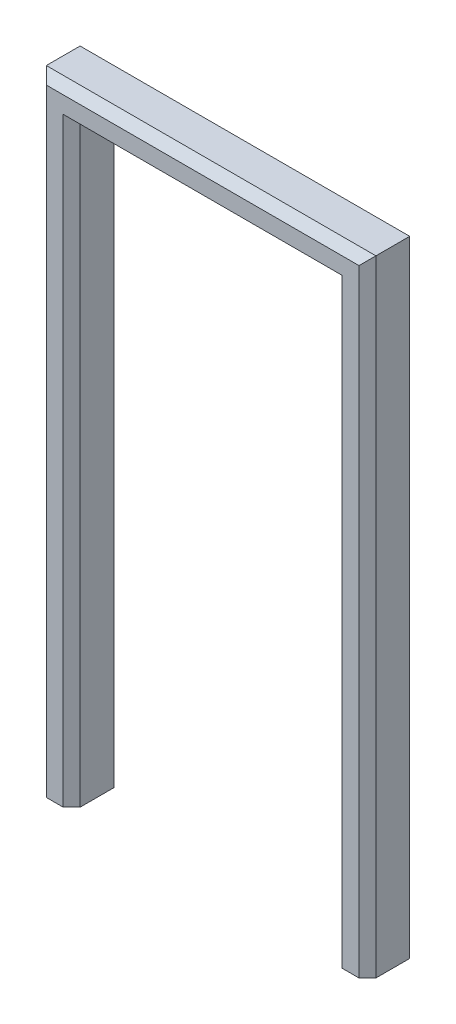
ISO-10303-21;
HEADER;
FILE_DESCRIPTION(('STEP AP214'),'2;1');
FILE_NAME('part.step','',(''),(''),'','','');
FILE_SCHEMA(('AUTOMOTIVE_DESIGN { 1 0 10303 214 1 1 1 1 }'));
ENDSEC;
DATA;
#1=APPLICATION_CONTEXT('core data for automotive mechanical design processes');
#2=APPLICATION_PROTOCOL_DEFINITION('international standard','automotive_design',2000,#1);
#3=PRODUCT_CONTEXT('',#1,'mechanical');
#4=PRODUCT('Part','Part','',(#3));
#5=PRODUCT_RELATED_PRODUCT_CATEGORY('part','',(#4));
#6=PRODUCT_DEFINITION_FORMATION('','',#4);
#7=PRODUCT_DEFINITION_CONTEXT('part definition',#1,'design');
#8=PRODUCT_DEFINITION('design','',#6,#7);
#9=PRODUCT_DEFINITION_SHAPE('','',#8);
#10=(LENGTH_UNIT() NAMED_UNIT(*) SI_UNIT(.MILLI.,.METRE.));
#11=(NAMED_UNIT(*) PLANE_ANGLE_UNIT() SI_UNIT($,.RADIAN.));
#12=(NAMED_UNIT(*) SI_UNIT($,.STERADIAN.) SOLID_ANGLE_UNIT());
#13=UNCERTAINTY_MEASURE_WITH_UNIT(LENGTH_MEASURE(1.E-05),#10,'distance_accuracy_value','');
#14=(GEOMETRIC_REPRESENTATION_CONTEXT(3) GLOBAL_UNCERTAINTY_ASSIGNED_CONTEXT((#13)) GLOBAL_UNIT_ASSIGNED_CONTEXT((#10,
#11,#12)) REPRESENTATION_CONTEXT('',''));
#15=CARTESIAN_POINT('',(0.,0.,0.));
#16=DIRECTION('',(0.,0.,1.));
#17=DIRECTION('',(1.,0.,0.));
#18=AXIS2_PLACEMENT_3D('',#15,#16,#17);
#19=CARTESIAN_POINT('',(0.,140.,0.));
#20=DIRECTION('',(0.,1.,0.));
#21=DIRECTION('',(0.,0.,1.));
#22=AXIS2_PLACEMENT_3D('',#19,#20,#21);
#23=PLANE('',#22);
#24=DIRECTION('',(0.,0.,-1.));
#25=VECTOR('',#24,1.);
#26=CARTESIAN_POINT('',(-31.,140.,6.));
#27=LINE('',#26,#25);
#28=CARTESIAN_POINT('',(-31.,140.,3.99999999999999));
#29=VERTEX_POINT('',#28);
#30=CARTESIAN_POINT('',(-31.,140.,-4.00000000000001));
#31=VERTEX_POINT('',#30);
#32=EDGE_CURVE('E176',#29,#31,#27,.T.);
#33=ORIENTED_EDGE('',*,*,#32,.T.);
#34=DIRECTION('',(1.,0.,0.));
#35=VECTOR('',#34,1.);
#36=CARTESIAN_POINT('',(0.,140.,-4.00000000000001));
#37=LINE('',#36,#35);
#38=CARTESIAN_POINT('',(31.,140.,-4.));
#39=VERTEX_POINT('',#38);
#40=EDGE_CURVE('E213',#31,#39,#37,.T.);
#41=ORIENTED_EDGE('',*,*,#40,.T.);
#42=DIRECTION('',(0.,0.,1.));
#43=VECTOR('',#42,1.);
#44=CARTESIAN_POINT('',(31.,140.,5.99999999999999));
#45=LINE('',#44,#43);
#46=CARTESIAN_POINT('',(31.,140.,3.99999999999998));
#47=VERTEX_POINT('',#46);
#48=EDGE_CURVE('E245',#39,#47,#45,.T.);
#49=ORIENTED_EDGE('',*,*,#48,.T.);
#50=DIRECTION('',(-1.,0.,0.));
#51=VECTOR('',#50,1.);
#52=CARTESIAN_POINT('',(0.,140.,3.99999999999998));
#53=LINE('',#52,#51);
#54=EDGE_CURVE('E210',#47,#29,#53,.T.);
#55=ORIENTED_EDGE('',*,*,#54,.T.);
#56=EDGE_LOOP('',(#33,#41,#49,#55));
#57=FACE_BOUND('',#56,.T.);
#58=ADVANCED_FACE('F51',(#57),#23,.F.);
#59=CARTESIAN_POINT('',(-31.,140.,6.));
#60=DIRECTION('',(-1.,0.,0.));
#61=DIRECTION('',(0.,0.,1.));
#62=AXIS2_PLACEMENT_3D('',#59,#60,#61);
#63=PLANE('',#62);
#64=DIRECTION('',(0.,0.,-1.));
#65=VECTOR('',#64,1.);
#66=CARTESIAN_POINT('',(-31.,0.,6.));
#67=LINE('',#66,#65);
#68=CARTESIAN_POINT('',(-31.,0.,3.99999999999999));
#69=VERTEX_POINT('',#68);
#70=CARTESIAN_POINT('',(-31.,0.,-4.00000000000001));
#71=VERTEX_POINT('',#70);
#72=EDGE_CURVE('E188',#69,#71,#67,.T.);
#73=ORIENTED_EDGE('',*,*,#72,.T.);
#74=DIRECTION('',(0.,1.,0.));
#75=VECTOR('',#74,1.);
#76=CARTESIAN_POINT('',(-31.,140.,-4.00000000000001));
#77=LINE('',#76,#75);
#78=EDGE_CURVE('E192',#71,#31,#77,.T.);
#79=ORIENTED_EDGE('',*,*,#78,.T.);
#80=ORIENTED_EDGE('',*,*,#32,.F.);
#81=DIRECTION('',(0.,-1.,0.));
#82=VECTOR('',#81,1.);
#83=CARTESIAN_POINT('',(-31.,140.,3.99999999999999));
#84=LINE('',#83,#82);
#85=EDGE_CURVE('E216',#29,#69,#84,.T.);
#86=ORIENTED_EDGE('',*,*,#85,.T.);
#87=EDGE_LOOP('',(#73,#79,#80,#86));
#88=FACE_BOUND('',#87,.T.);
#89=ADVANCED_FACE('F383',(#88),#63,.F.);
#90=CARTESIAN_POINT('',(-39.,140.,-6.));
#91=DIRECTION('',(0.,0.,1.));
#92=DIRECTION('',(1.,0.,0.));
#93=AXIS2_PLACEMENT_3D('',#90,#91,#92);
#94=PLANE('',#93);
#95=DIRECTION('',(1.,0.,0.));
#96=VECTOR('',#95,1.);
#97=CARTESIAN_POINT('',(39.,146.,-6.));
#98=LINE('',#97,#96);
#99=CARTESIAN_POINT('',(-37.,146.,-6.));
#100=VERTEX_POINT('',#99);
#101=CARTESIAN_POINT('',(37.,146.,-6.));
#102=VERTEX_POINT('',#101);
#103=EDGE_CURVE('E299',#100,#102,#98,.T.);
#104=ORIENTED_EDGE('',*,*,#103,.T.);
#105=DIRECTION('',(0.,-1.,0.));
#106=VECTOR('',#105,1.);
#107=CARTESIAN_POINT('',(37.,140.,-6.));
#108=LINE('',#107,#106);
#109=CARTESIAN_POINT('',(37.,0.,-6.00000000000001));
#110=VERTEX_POINT('',#109);
#111=EDGE_CURVE('E302',#102,#110,#108,.T.);
#112=ORIENTED_EDGE('',*,*,#111,.T.);
#113=DIRECTION('',(-1.,0.,0.));
#114=VECTOR('',#113,1.);
#115=CARTESIAN_POINT('',(31.,0.,-6.00000000000001));
#116=LINE('',#115,#114);
#117=CARTESIAN_POINT('',(33.,0.,-6.00000000000001));
#118=VERTEX_POINT('',#117);
#119=EDGE_CURVE('E360',#110,#118,#116,.T.);
#120=ORIENTED_EDGE('',*,*,#119,.T.);
#121=DIRECTION('',(0.,1.,0.));
#122=VECTOR('',#121,1.);
#123=CARTESIAN_POINT('',(33.,140.,-6.));
#124=LINE('',#123,#122);
#125=CARTESIAN_POINT('',(33.,142.,-6.));
#126=VERTEX_POINT('',#125);
#127=EDGE_CURVE('E293',#118,#126,#124,.T.);
#128=ORIENTED_EDGE('',*,*,#127,.T.);
#129=DIRECTION('',(-1.,0.,0.));
#130=VECTOR('',#129,1.);
#131=CARTESIAN_POINT('',(-39.,142.,-6.));
#132=LINE('',#131,#130);
#133=CARTESIAN_POINT('',(-33.,142.,-6.));
#134=VERTEX_POINT('',#133);
#135=EDGE_CURVE('E170',#126,#134,#132,.T.);
#136=ORIENTED_EDGE('',*,*,#135,.T.);
#137=DIRECTION('',(0.,-1.,0.));
#138=VECTOR('',#137,1.);
#139=CARTESIAN_POINT('',(-33.,140.,-6.));
#140=LINE('',#139,#138);
#141=CARTESIAN_POINT('',(-33.,0.,-6.));
#142=VERTEX_POINT('',#141);
#143=EDGE_CURVE('E164',#134,#142,#140,.T.);
#144=ORIENTED_EDGE('',*,*,#143,.T.);
#145=DIRECTION('',(-1.,0.,0.));
#146=VECTOR('',#145,1.);
#147=CARTESIAN_POINT('',(-39.,0.,-6.));
#148=LINE('',#147,#146);
#149=CARTESIAN_POINT('',(-37.,0.,-6.));
#150=VERTEX_POINT('',#149);
#151=EDGE_CURVE('E167',#142,#150,#148,.T.);
#152=ORIENTED_EDGE('',*,*,#151,.T.);
#153=DIRECTION('',(0.,1.,0.));
#154=VECTOR('',#153,1.);
#155=CARTESIAN_POINT('',(-37.,140.,-6.));
#156=LINE('',#155,#154);
#157=EDGE_CURVE('E296',#150,#100,#156,.T.);
#158=ORIENTED_EDGE('',*,*,#157,.T.);
#159=EDGE_LOOP('',(#104,#112,#120,#128,#136,#144,#152,#158));
#160=FACE_BOUND('',#159,.T.);
#161=ADVANCED_FACE('F166',(#160),#94,.F.);
#162=CARTESIAN_POINT('',(-39.,140.,6.));
#163=DIRECTION('',(1.,0.,0.));
#164=DIRECTION('',(0.,0.,-1.));
#165=AXIS2_PLACEMENT_3D('',#162,#163,#164);
#166=PLANE('',#165);
#167=DIRECTION('',(0.,0.,1.));
#168=VECTOR('',#167,1.);
#169=CARTESIAN_POINT('',(-39.,148.,-6.));
#170=LINE('',#169,#168);
#171=CARTESIAN_POINT('',(-39.,148.,-3.99999999999998));
#172=VERTEX_POINT('',#171);
#173=CARTESIAN_POINT('',(-39.,148.,3.99999999999999));
#174=VERTEX_POINT('',#173);
#175=EDGE_CURVE('E340',#172,#174,#170,.T.);
#176=ORIENTED_EDGE('',*,*,#175,.F.);
#177=DIRECTION('',(0.,-1.,0.));
#178=VECTOR('',#177,1.);
#179=CARTESIAN_POINT('',(-39.,140.,-3.99999999999998));
#180=LINE('',#179,#178);
#181=CARTESIAN_POINT('',(-39.,0.,-3.99999999999998));
#182=VERTEX_POINT('',#181);
#183=EDGE_CURVE('E332',#172,#182,#180,.T.);
#184=ORIENTED_EDGE('',*,*,#183,.T.);
#185=DIRECTION('',(0.,0.,1.));
#186=VECTOR('',#185,1.);
#187=CARTESIAN_POINT('',(-39.,0.,6.));
#188=LINE('',#187,#186);
#189=CARTESIAN_POINT('',(-39.,0.,3.99999999999999));
#190=VERTEX_POINT('',#189);
#191=EDGE_CURVE('E187',#182,#190,#188,.T.);
#192=ORIENTED_EDGE('',*,*,#191,.T.);
#193=DIRECTION('',(0.,1.,0.));
#194=VECTOR('',#193,1.);
#195=CARTESIAN_POINT('',(-39.,140.,3.99999999999999));
#196=LINE('',#195,#194);
#197=EDGE_CURVE('E278',#190,#174,#196,.T.);
#198=ORIENTED_EDGE('',*,*,#197,.T.);
#199=EDGE_LOOP('',(#176,#184,#192,#198));
#200=FACE_BOUND('',#199,.T.);
#201=ADVANCED_FACE('F338',(#200),#166,.F.);
#202=CARTESIAN_POINT('',(-39.,140.,6.));
#203=DIRECTION('',(0.,0.,-1.));
#204=DIRECTION('',(-1.,0.,0.));
#205=AXIS2_PLACEMENT_3D('',#202,#203,#204);
#206=PLANE('',#205);
#207=DIRECTION('',(1.,0.,0.));
#208=VECTOR('',#207,1.);
#209=CARTESIAN_POINT('',(-39.,0.,6.));
#210=LINE('',#209,#208);
#211=CARTESIAN_POINT('',(-37.,0.,6.));
#212=VERTEX_POINT('',#211);
#213=CARTESIAN_POINT('',(-33.,0.,6.));
#214=VERTEX_POINT('',#213);
#215=EDGE_CURVE('E281',#212,#214,#210,.T.);
#216=ORIENTED_EDGE('',*,*,#215,.T.);
#217=DIRECTION('',(0.,1.,0.));
#218=VECTOR('',#217,1.);
#219=CARTESIAN_POINT('',(-33.,140.,6.));
#220=LINE('',#219,#218);
#221=CARTESIAN_POINT('',(-33.,142.,6.));
#222=VERTEX_POINT('',#221);
#223=EDGE_CURVE('E11',#214,#222,#220,.T.);
#224=ORIENTED_EDGE('',*,*,#223,.T.);
#225=DIRECTION('',(1.,0.,0.));
#226=VECTOR('',#225,1.);
#227=CARTESIAN_POINT('',(-39.,142.,6.));
#228=LINE('',#227,#226);
#229=CARTESIAN_POINT('',(33.,142.,6.));
#230=VERTEX_POINT('',#229);
#231=EDGE_CURVE('E62',#222,#230,#228,.T.);
#232=ORIENTED_EDGE('',*,*,#231,.T.);
#233=DIRECTION('',(0.,-1.,0.));
#234=VECTOR('',#233,1.);
#235=CARTESIAN_POINT('',(33.,140.,6.));
#236=LINE('',#235,#234);
#237=CARTESIAN_POINT('',(33.,0.,5.99999999999999));
#238=VERTEX_POINT('',#237);
#239=EDGE_CURVE('E231',#230,#238,#236,.T.);
#240=ORIENTED_EDGE('',*,*,#239,.T.);
#241=DIRECTION('',(1.,0.,0.));
#242=VECTOR('',#241,1.);
#243=CARTESIAN_POINT('',(31.,0.,5.99999999999999));
#244=LINE('',#243,#242);
#245=CARTESIAN_POINT('',(37.,0.,5.99999999999999));
#246=VERTEX_POINT('',#245);
#247=EDGE_CURVE('E377',#238,#246,#244,.T.);
#248=ORIENTED_EDGE('',*,*,#247,.T.);
#249=DIRECTION('',(0.,1.,0.));
#250=VECTOR('',#249,1.);
#251=CARTESIAN_POINT('',(37.,140.,6.));
#252=LINE('',#251,#250);
#253=CARTESIAN_POINT('',(37.,146.,6.));
#254=VERTEX_POINT('',#253);
#255=EDGE_CURVE('E228',#246,#254,#252,.T.);
#256=ORIENTED_EDGE('',*,*,#255,.T.);
#257=DIRECTION('',(-1.,0.,0.));
#258=VECTOR('',#257,1.);
#259=CARTESIAN_POINT('',(-39.,146.,6.));
#260=LINE('',#259,#258);
#261=CARTESIAN_POINT('',(-37.,146.,6.));
#262=VERTEX_POINT('',#261);
#263=EDGE_CURVE('E225',#254,#262,#260,.T.);
#264=ORIENTED_EDGE('',*,*,#263,.T.);
#265=DIRECTION('',(0.,-1.,0.));
#266=VECTOR('',#265,1.);
#267=CARTESIAN_POINT('',(-37.,140.,6.));
#268=LINE('',#267,#266);
#269=EDGE_CURVE('E222',#262,#212,#268,.T.);
#270=ORIENTED_EDGE('',*,*,#269,.T.);
#271=EDGE_LOOP('',(#216,#224,#232,#240,#248,#256,#264,#270));
#272=FACE_BOUND('',#271,.T.);
#273=ADVANCED_FACE('F280',(#272),#206,.F.);
#274=CARTESIAN_POINT('',(0.,0.,0.));
#275=DIRECTION('',(0.,-1.,0.));
#276=DIRECTION('',(0.,0.,-1.));
#277=AXIS2_PLACEMENT_3D('',#274,#275,#276);
#278=PLANE('',#277);
#279=ORIENTED_EDGE('',*,*,#191,.F.);
#280=DIRECTION('',(-0.707106781186548,0.,0.707106781186548));
#281=VECTOR('',#280,1.);
#282=CARTESIAN_POINT('',(-21.5,0.,-21.5));
#283=LINE('',#282,#281);
#284=EDGE_CURVE('E185',#182,#150,#283,.F.);
#285=ORIENTED_EDGE('',*,*,#284,.T.);
#286=ORIENTED_EDGE('',*,*,#151,.F.);
#287=DIRECTION('',(-0.70710678118655,0.,-0.707106781186545));
#288=VECTOR('',#287,1.);
#289=CARTESIAN_POINT('',(-13.4999999999999,0.,13.5));
#290=LINE('',#289,#288);
#291=EDGE_CURVE('E182',#142,#71,#290,.F.);
#292=ORIENTED_EDGE('',*,*,#291,.T.);
#293=ORIENTED_EDGE('',*,*,#72,.F.);
#294=DIRECTION('',(0.707106781186548,0.,-0.707106781186547));
#295=VECTOR('',#294,1.);
#296=CARTESIAN_POINT('',(-13.5,0.,-13.5));
#297=LINE('',#296,#295);
#298=EDGE_CURVE('E194',#69,#214,#297,.F.);
#299=ORIENTED_EDGE('',*,*,#298,.T.);
#300=ORIENTED_EDGE('',*,*,#215,.F.);
#301=DIRECTION('',(0.707106781186548,0.,0.707106781186548));
#302=VECTOR('',#301,1.);
#303=CARTESIAN_POINT('',(-21.5,0.,21.5));
#304=LINE('',#303,#302);
#305=EDGE_CURVE('E200',#212,#190,#304,.F.);
#306=ORIENTED_EDGE('',*,*,#305,.T.);
#307=EDGE_LOOP('',(#279,#285,#286,#292,#293,#299,#300,#306));
#308=FACE_BOUND('',#307,.T.);
#309=ADVANCED_FACE('F180',(#308),#278,.T.);
#310=CARTESIAN_POINT('',(39.,148.,-6.));
#311=DIRECTION('',(-1.,0.,0.));
#312=DIRECTION('',(0.,0.,1.));
#313=AXIS2_PLACEMENT_3D('',#310,#311,#312);
#314=PLANE('',#313);
#315=DIRECTION('',(0.,0.,-1.));
#316=VECTOR('',#315,1.);
#317=CARTESIAN_POINT('',(39.,0.,5.99999999999999));
#318=LINE('',#317,#316);
#319=CARTESIAN_POINT('',(39.,0.,3.99999999999998));
#320=VERTEX_POINT('',#319);
#321=CARTESIAN_POINT('',(39.,0.,-3.99999999999998));
#322=VERTEX_POINT('',#321);
#323=EDGE_CURVE('E359',#320,#322,#318,.T.);
#324=ORIENTED_EDGE('',*,*,#323,.T.);
#325=DIRECTION('',(0.,1.,0.));
#326=VECTOR('',#325,1.);
#327=CARTESIAN_POINT('',(39.,148.,-3.99999999999998));
#328=LINE('',#327,#326);
#329=CARTESIAN_POINT('',(39.,148.,-3.99999999999998));
#330=VERTEX_POINT('',#329);
#331=EDGE_CURVE('E322',#322,#330,#328,.T.);
#332=ORIENTED_EDGE('',*,*,#331,.T.);
#333=DIRECTION('',(0.,0.,-1.));
#334=VECTOR('',#333,1.);
#335=CARTESIAN_POINT('',(39.,148.,-6.));
#336=LINE('',#335,#334);
#337=CARTESIAN_POINT('',(39.,148.,3.99999999999998));
#338=VERTEX_POINT('',#337);
#339=EDGE_CURVE('E369',#338,#330,#336,.T.);
#340=ORIENTED_EDGE('',*,*,#339,.F.);
#341=DIRECTION('',(0.,-1.,0.));
#342=VECTOR('',#341,1.);
#343=CARTESIAN_POINT('',(39.,148.,3.99999999999998));
#344=LINE('',#343,#342);
#345=EDGE_CURVE('E318',#338,#320,#344,.T.);
#346=ORIENTED_EDGE('',*,*,#345,.T.);
#347=EDGE_LOOP('',(#324,#332,#340,#346));
#348=FACE_BOUND('',#347,.T.);
#349=ADVANCED_FACE('F362',(#348),#314,.F.);
#350=CARTESIAN_POINT('',(0.,148.,0.));
#351=DIRECTION('',(0.,1.,0.));
#352=DIRECTION('',(0.,0.,1.));
#353=AXIS2_PLACEMENT_3D('',#350,#351,#352);
#354=PLANE('',#353);
#355=ORIENTED_EDGE('',*,*,#339,.T.);
#356=DIRECTION('',(-1.,0.,0.));
#357=VECTOR('',#356,1.);
#358=CARTESIAN_POINT('',(-39.,148.,-3.99999999999998));
#359=LINE('',#358,#357);
#360=EDGE_CURVE('E327',#330,#172,#359,.T.);
#361=ORIENTED_EDGE('',*,*,#360,.T.);
#362=ORIENTED_EDGE('',*,*,#175,.T.);
#363=DIRECTION('',(1.,0.,0.));
#364=VECTOR('',#363,1.);
#365=CARTESIAN_POINT('',(39.,148.,3.99999999999998));
#366=LINE('',#365,#364);
#367=EDGE_CURVE('E273',#174,#338,#366,.T.);
#368=ORIENTED_EDGE('',*,*,#367,.T.);
#369=EDGE_LOOP('',(#355,#361,#362,#368));
#370=FACE_BOUND('',#369,.T.);
#371=ADVANCED_FACE('F424',(#370),#354,.T.);
#372=CARTESIAN_POINT('',(31.,140.,5.99999999999999));
#373=DIRECTION('',(1.,0.,0.));
#374=DIRECTION('',(0.,0.,-1.));
#375=AXIS2_PLACEMENT_3D('',#372,#373,#374);
#376=PLANE('',#375);
#377=ORIENTED_EDGE('',*,*,#48,.F.);
#378=DIRECTION('',(0.,-1.,0.));
#379=VECTOR('',#378,1.);
#380=CARTESIAN_POINT('',(31.,140.,-4.00000000000001));
#381=LINE('',#380,#379);
#382=CARTESIAN_POINT('',(31.,0.,-4.));
#383=VERTEX_POINT('',#382);
#384=EDGE_CURVE('E206',#39,#383,#381,.T.);
#385=ORIENTED_EDGE('',*,*,#384,.T.);
#386=DIRECTION('',(0.,0.,1.));
#387=VECTOR('',#386,1.);
#388=CARTESIAN_POINT('',(31.,0.,5.99999999999999));
#389=LINE('',#388,#387);
#390=CARTESIAN_POINT('',(31.,0.,3.99999999999998));
#391=VERTEX_POINT('',#390);
#392=EDGE_CURVE('E371',#383,#391,#389,.T.);
#393=ORIENTED_EDGE('',*,*,#392,.T.);
#394=DIRECTION('',(0.,1.,0.));
#395=VECTOR('',#394,1.);
#396=CARTESIAN_POINT('',(31.,140.,3.99999999999998));
#397=LINE('',#396,#395);
#398=EDGE_CURVE('E198',#391,#47,#397,.T.);
#399=ORIENTED_EDGE('',*,*,#398,.T.);
#400=EDGE_LOOP('',(#377,#385,#393,#399));
#401=FACE_BOUND('',#400,.T.);
#402=ADVANCED_FACE('F406',(#401),#376,.F.);
#403=CARTESIAN_POINT('',(0.,0.,0.));
#404=DIRECTION('',(0.,-1.,0.));
#405=DIRECTION('',(0.,0.,-1.));
#406=AXIS2_PLACEMENT_3D('',#403,#404,#405);
#407=PLANE('',#406);
#408=ORIENTED_EDGE('',*,*,#119,.F.);
#409=DIRECTION('',(-0.707106781186547,0.,-0.707106781186548));
#410=VECTOR('',#409,1.);
#411=CARTESIAN_POINT('',(21.5,0.,-21.5));
#412=LINE('',#411,#410);
#413=EDGE_CURVE('E315',#110,#322,#412,.F.);
#414=ORIENTED_EDGE('',*,*,#413,.T.);
#415=ORIENTED_EDGE('',*,*,#323,.F.);
#416=DIRECTION('',(0.707106781186549,0.,-0.707106781186546));
#417=VECTOR('',#416,1.);
#418=CARTESIAN_POINT('',(21.4999999999999,0.,21.5));
#419=LINE('',#418,#417);
#420=EDGE_CURVE('E306',#320,#246,#419,.F.);
#421=ORIENTED_EDGE('',*,*,#420,.T.);
#422=ORIENTED_EDGE('',*,*,#247,.F.);
#423=DIRECTION('',(0.707106781186546,0.,0.707106781186549));
#424=VECTOR('',#423,1.);
#425=CARTESIAN_POINT('',(13.5000000000001,0.,-13.5));
#426=LINE('',#425,#424);
#427=EDGE_CURVE('E309',#238,#391,#426,.F.);
#428=ORIENTED_EDGE('',*,*,#427,.T.);
#429=ORIENTED_EDGE('',*,*,#392,.F.);
#430=DIRECTION('',(-0.707106781186551,0.,0.707106781186544));
#431=VECTOR('',#430,1.);
#432=CARTESIAN_POINT('',(13.4999999999998,0.,13.5));
#433=LINE('',#432,#431);
#434=EDGE_CURVE('E312',#383,#118,#433,.F.);
#435=ORIENTED_EDGE('',*,*,#434,.T.);
#436=EDGE_LOOP('',(#408,#414,#415,#421,#422,#428,#429,#435));
#437=FACE_BOUND('',#436,.T.);
#438=ADVANCED_FACE('F358',(#437),#407,.T.);
#439=CARTESIAN_POINT('',(-39.,140.,-3.99999999999998));
#440=DIRECTION('',(0.707106781186547,0.,0.707106781186547));
#441=DIRECTION('',(0.,-1.,0.));
#442=AXIS2_PLACEMENT_3D('',#439,#440,#441);
#443=PLANE('',#442);
#444=ORIENTED_EDGE('',*,*,#284,.F.);
#445=ORIENTED_EDGE('',*,*,#183,.F.);
#446=DIRECTION('',(-0.577350269189627,0.577350269189623,0.577350269189627));
#447=VECTOR('',#446,1.);
#448=CARTESIAN_POINT('',(-36.3333333333333,145.333333333333,-6.66666666666664));
#449=LINE('',#448,#447);
#450=EDGE_CURVE('E240',#100,#172,#449,.T.);
#451=ORIENTED_EDGE('',*,*,#450,.F.);
#452=ORIENTED_EDGE('',*,*,#157,.F.);
#453=EDGE_LOOP('',(#444,#445,#451,#452));
#454=FACE_BOUND('',#453,.T.);
#455=ADVANCED_FACE('F343',(#454),#443,.F.);
#456=CARTESIAN_POINT('',(0.,148.,-3.99999999999998));
#457=DIRECTION('',(0.,0.70710678118655,-0.707106781186545));
#458=DIRECTION('',(1.,0.,0.));
#459=AXIS2_PLACEMENT_3D('',#456,#457,#458);
#460=PLANE('',#459);
#461=ORIENTED_EDGE('',*,*,#450,.T.);
#462=ORIENTED_EDGE('',*,*,#360,.F.);
#463=DIRECTION('',(0.577350269189627,0.577350269189623,0.577350269189627));
#464=VECTOR('',#463,1.);
#465=CARTESIAN_POINT('',(26.,135.,-17.));
#466=LINE('',#465,#464);
#467=EDGE_CURVE('E236',#102,#330,#466,.T.);
#468=ORIENTED_EDGE('',*,*,#467,.F.);
#469=ORIENTED_EDGE('',*,*,#103,.F.);
#470=EDGE_LOOP('',(#461,#462,#468,#469));
#471=FACE_BOUND('',#470,.T.);
#472=ADVANCED_FACE('F351',(#471),#460,.T.);
#473=CARTESIAN_POINT('',(37.,140.,-6.));
#474=DIRECTION('',(-0.707106781186548,0.,0.707106781186547));
#475=DIRECTION('',(0.,-1.,0.));
#476=AXIS2_PLACEMENT_3D('',#473,#474,#475);
#477=PLANE('',#476);
#478=ORIENTED_EDGE('',*,*,#467,.T.);
#479=ORIENTED_EDGE('',*,*,#331,.F.);
#480=ORIENTED_EDGE('',*,*,#413,.F.);
#481=ORIENTED_EDGE('',*,*,#111,.F.);
#482=EDGE_LOOP('',(#478,#479,#480,#481));
#483=FACE_BOUND('',#482,.T.);
#484=ADVANCED_FACE('F354',(#483),#477,.F.);
#485=CARTESIAN_POINT('',(-33.,140.,-6.));
#486=DIRECTION('',(-0.707106781186545,0.,0.70710678118655));
#487=DIRECTION('',(0.,-1.,0.));
#488=AXIS2_PLACEMENT_3D('',#485,#486,#487);
#489=PLANE('',#488);
#490=ORIENTED_EDGE('',*,*,#291,.F.);
#491=ORIENTED_EDGE('',*,*,#143,.F.);
#492=DIRECTION('',(0.577350269189627,-0.577350269189627,0.577350269189623));
#493=VECTOR('',#492,1.);
#494=CARTESIAN_POINT('',(-35.,144.,-7.99999999999999));
#495=LINE('',#494,#493);
#496=EDGE_CURVE('E241',#31,#134,#495,.F.);
#497=ORIENTED_EDGE('',*,*,#496,.F.);
#498=ORIENTED_EDGE('',*,*,#78,.F.);
#499=EDGE_LOOP('',(#490,#491,#497,#498));
#500=FACE_BOUND('',#499,.T.);
#501=ADVANCED_FACE('F191',(#500),#489,.F.);
#502=CARTESIAN_POINT('',(-39.,142.,-6.));
#503=DIRECTION('',(0.,0.707106781186545,0.70710678118655));
#504=DIRECTION('',(-1.,0.,0.));
#505=AXIS2_PLACEMENT_3D('',#502,#503,#504);
#506=PLANE('',#505);
#507=ORIENTED_EDGE('',*,*,#496,.T.);
#508=ORIENTED_EDGE('',*,*,#135,.F.);
#509=DIRECTION('',(-0.577350269189628,-0.577350269189626,0.577350269189622));
#510=VECTOR('',#509,1.);
#511=CARTESIAN_POINT('',(31.,140.,-4.00000000000001));
#512=LINE('',#511,#510);
#513=EDGE_CURVE('E246',#39,#126,#512,.F.);
#514=ORIENTED_EDGE('',*,*,#513,.F.);
#515=ORIENTED_EDGE('',*,*,#40,.F.);
#516=EDGE_LOOP('',(#507,#508,#514,#515));
#517=FACE_BOUND('',#516,.T.);
#518=ADVANCED_FACE('F414',(#517),#506,.F.);
#519=CARTESIAN_POINT('',(31.,140.,-4.00000000000001));
#520=DIRECTION('',(0.707106781186544,0.,0.707106781186551));
#521=DIRECTION('',(0.,-1.,0.));
#522=AXIS2_PLACEMENT_3D('',#519,#520,#521);
#523=PLANE('',#522);
#524=ORIENTED_EDGE('',*,*,#513,.T.);
#525=ORIENTED_EDGE('',*,*,#127,.F.);
#526=ORIENTED_EDGE('',*,*,#434,.F.);
#527=ORIENTED_EDGE('',*,*,#384,.F.);
#528=EDGE_LOOP('',(#524,#525,#526,#527));
#529=FACE_BOUND('',#528,.T.);
#530=ADVANCED_FACE('F410',(#529),#523,.F.);
#531=CARTESIAN_POINT('',(33.,140.,6.));
#532=DIRECTION('',(0.707106781186549,0.,-0.707106781186546));
#533=DIRECTION('',(0.,-1.,0.));
#534=AXIS2_PLACEMENT_3D('',#531,#532,#533);
#535=PLANE('',#534);
#536=ORIENTED_EDGE('',*,*,#427,.F.);
#537=ORIENTED_EDGE('',*,*,#239,.F.);
#538=DIRECTION('',(-0.577350269189626,-0.577350269189624,-0.577350269189628));
#539=VECTOR('',#538,1.);
#540=CARTESIAN_POINT('',(9.00000000000001,118.,-18.0000000000001));
#541=LINE('',#540,#539);
#542=EDGE_CURVE('E250',#47,#230,#541,.F.);
#543=ORIENTED_EDGE('',*,*,#542,.F.);
#544=ORIENTED_EDGE('',*,*,#398,.F.);
#545=EDGE_LOOP('',(#536,#537,#543,#544));
#546=FACE_BOUND('',#545,.T.);
#547=ADVANCED_FACE('F396',(#546),#535,.F.);
#548=CARTESIAN_POINT('',(-39.,142.,6.));
#549=DIRECTION('',(0.,0.70710678118655,-0.707106781186545));
#550=DIRECTION('',(1.,0.,0.));
#551=AXIS2_PLACEMENT_3D('',#548,#549,#550);
#552=PLANE('',#551);
#553=ORIENTED_EDGE('',*,*,#542,.T.);
#554=ORIENTED_EDGE('',*,*,#231,.F.);
#555=DIRECTION('',(0.577350269189628,-0.577350269189623,-0.577350269189627));
#556=VECTOR('',#555,1.);
#557=CARTESIAN_POINT('',(-31.,140.,3.99999999999999));
#558=LINE('',#557,#556);
#559=EDGE_CURVE('E253',#29,#222,#558,.F.);
#560=ORIENTED_EDGE('',*,*,#559,.F.);
#561=ORIENTED_EDGE('',*,*,#54,.F.);
#562=EDGE_LOOP('',(#553,#554,#560,#561));
#563=FACE_BOUND('',#562,.T.);
#564=ADVANCED_FACE('F391',(#563),#552,.F.);
#565=CARTESIAN_POINT('',(-31.,140.,3.99999999999999));
#566=DIRECTION('',(-0.707106781186547,0.,-0.707106781186548));
#567=DIRECTION('',(0.,-1.,0.));
#568=AXIS2_PLACEMENT_3D('',#565,#566,#567);
#569=PLANE('',#568);
#570=ORIENTED_EDGE('',*,*,#559,.T.);
#571=ORIENTED_EDGE('',*,*,#223,.F.);
#572=ORIENTED_EDGE('',*,*,#298,.F.);
#573=ORIENTED_EDGE('',*,*,#85,.F.);
#574=EDGE_LOOP('',(#570,#571,#572,#573));
#575=FACE_BOUND('',#574,.T.);
#576=ADVANCED_FACE('F388',(#575),#569,.F.);
#577=CARTESIAN_POINT('',(-37.,140.,6.));
#578=DIRECTION('',(0.707106781186547,0.,-0.707106781186547));
#579=DIRECTION('',(0.,-1.,0.));
#580=AXIS2_PLACEMENT_3D('',#577,#578,#579);
#581=PLANE('',#580);
#582=ORIENTED_EDGE('',*,*,#305,.F.);
#583=ORIENTED_EDGE('',*,*,#269,.F.);
#584=DIRECTION('',(0.577350269189627,-0.577350269189623,0.577350269189627));
#585=VECTOR('',#584,1.);
#586=CARTESIAN_POINT('',(-35.,144.,8.));
#587=LINE('',#586,#585);
#588=EDGE_CURVE('E56',#174,#262,#587,.T.);
#589=ORIENTED_EDGE('',*,*,#588,.F.);
#590=ORIENTED_EDGE('',*,*,#197,.F.);
#591=EDGE_LOOP('',(#582,#583,#589,#590));
#592=FACE_BOUND('',#591,.T.);
#593=ADVANCED_FACE('F54',(#592),#581,.F.);
#594=CARTESIAN_POINT('',(0.,148.,3.99999999999998));
#595=DIRECTION('',(0.,0.70710678118655,0.707106781186545));
#596=DIRECTION('',(-1.,0.,0.));
#597=AXIS2_PLACEMENT_3D('',#594,#595,#596);
#598=PLANE('',#597);
#599=ORIENTED_EDGE('',*,*,#588,.T.);
#600=ORIENTED_EDGE('',*,*,#263,.F.);
#601=DIRECTION('',(-0.577350269189628,-0.577350269189623,0.577350269189627));
#602=VECTOR('',#601,1.);
#603=CARTESIAN_POINT('',(25.9999999999999,135.,17.0000000000001));
#604=LINE('',#603,#602);
#605=EDGE_CURVE('E259',#338,#254,#604,.T.);
#606=ORIENTED_EDGE('',*,*,#605,.F.);
#607=ORIENTED_EDGE('',*,*,#367,.F.);
#608=EDGE_LOOP('',(#599,#600,#606,#607));
#609=FACE_BOUND('',#608,.T.);
#610=ADVANCED_FACE('F272',(#609),#598,.T.);
#611=CARTESIAN_POINT('',(39.,148.,3.99999999999998));
#612=DIRECTION('',(-0.707106781186546,0.,-0.707106781186549));
#613=DIRECTION('',(0.,-1.,0.));
#614=AXIS2_PLACEMENT_3D('',#611,#612,#613);
#615=PLANE('',#614);
#616=ORIENTED_EDGE('',*,*,#605,.T.);
#617=ORIENTED_EDGE('',*,*,#255,.F.);
#618=ORIENTED_EDGE('',*,*,#420,.F.);
#619=ORIENTED_EDGE('',*,*,#345,.F.);
#620=EDGE_LOOP('',(#616,#617,#618,#619));
#621=FACE_BOUND('',#620,.T.);
#622=ADVANCED_FACE('F482',(#621),#615,.F.);
#623=CLOSED_SHELL('',(#58,#89,#161,#201,#273,#309,#349,#371,#402,#438,#455,#472,#484,#501,#518,
#530,#547,#564,#576,#593,#610,#622));
#624=MANIFOLD_SOLID_BREP('B2',#623);
#625=ADVANCED_BREP_SHAPE_REPRESENTATION('',(#18,#624),#14);
#626=SHAPE_DEFINITION_REPRESENTATION(#9,#625);
ENDSEC;
END-ISO-10303-21;
